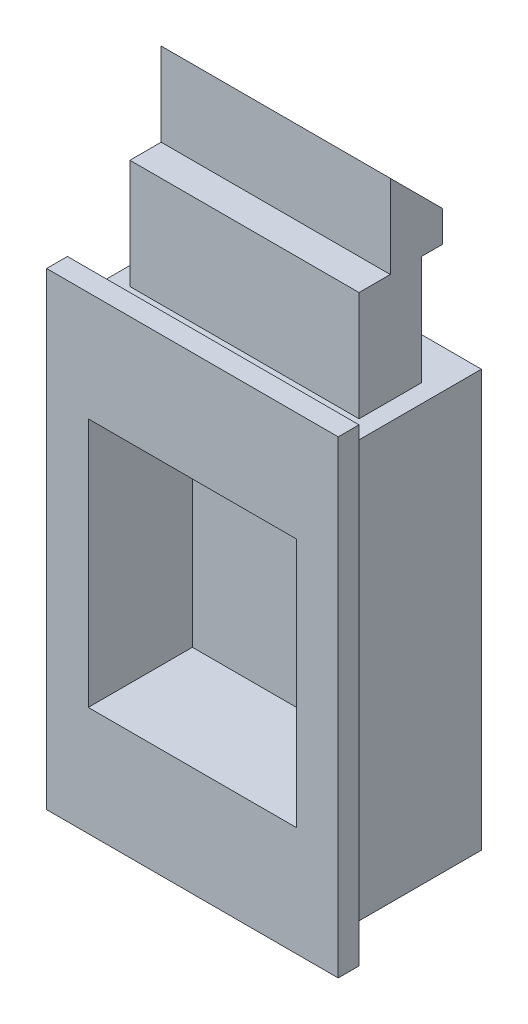
ISO-10303-21;
HEADER;
FILE_DESCRIPTION(('STEP AP214'),'2;1');
FILE_NAME('part.step','',(''),(''),'','','');
FILE_SCHEMA(('AUTOMOTIVE_DESIGN { 1 0 10303 214 1 1 1 1 }'));
ENDSEC;
DATA;
#1=APPLICATION_CONTEXT('core data for automotive mechanical design processes');
#2=APPLICATION_PROTOCOL_DEFINITION('international standard','automotive_design',2000,#1);
#3=PRODUCT_CONTEXT('',#1,'mechanical');
#4=PRODUCT('Part','Part','',(#3));
#5=PRODUCT_RELATED_PRODUCT_CATEGORY('part','',(#4));
#6=PRODUCT_DEFINITION_FORMATION('','',#4);
#7=PRODUCT_DEFINITION_CONTEXT('part definition',#1,'design');
#8=PRODUCT_DEFINITION('design','',#6,#7);
#9=PRODUCT_DEFINITION_SHAPE('','',#8);
#10=(LENGTH_UNIT() NAMED_UNIT(*) SI_UNIT(.MILLI.,.METRE.));
#11=(NAMED_UNIT(*) PLANE_ANGLE_UNIT() SI_UNIT($,.RADIAN.));
#12=(NAMED_UNIT(*) SI_UNIT($,.STERADIAN.) SOLID_ANGLE_UNIT());
#13=UNCERTAINTY_MEASURE_WITH_UNIT(LENGTH_MEASURE(1.E-05),#10,'distance_accuracy_value','');
#14=(GEOMETRIC_REPRESENTATION_CONTEXT(3) GLOBAL_UNCERTAINTY_ASSIGNED_CONTEXT((#13)) GLOBAL_UNIT_ASSIGNED_CONTEXT((#10,
#11,#12)) REPRESENTATION_CONTEXT('',''));
#15=CARTESIAN_POINT('',(0.,0.,0.));
#16=DIRECTION('',(0.,0.,1.));
#17=DIRECTION('',(1.,0.,0.));
#18=AXIS2_PLACEMENT_3D('',#15,#16,#17);
#19=CARTESIAN_POINT('',(12.75,20.,-13.));
#20=DIRECTION('',(0.,-1.,0.));
#21=DIRECTION('',(0.,0.,-1.));
#22=AXIS2_PLACEMENT_3D('',#19,#20,#21);
#23=PLANE('',#22);
#24=DIRECTION('',(1.,0.,0.));
#25=VECTOR('',#24,1.);
#26=CARTESIAN_POINT('',(12.75,20.,0.));
#27=LINE('',#26,#25);
#28=CARTESIAN_POINT('',(-12.75,20.,0.));
#29=VERTEX_POINT('',#28);
#30=CARTESIAN_POINT('',(12.75,20.,0.));
#31=VERTEX_POINT('',#30);
#32=EDGE_CURVE('E277',#29,#31,#27,.T.);
#33=ORIENTED_EDGE('',*,*,#32,.T.);
#34=DIRECTION('',(0.,0.,1.));
#35=VECTOR('',#34,1.);
#36=CARTESIAN_POINT('',(12.75,20.,-13.));
#37=LINE('',#36,#35);
#38=CARTESIAN_POINT('',(12.75,20.,-13.));
#39=VERTEX_POINT('',#38);
#40=EDGE_CURVE('E290',#39,#31,#37,.T.);
#41=ORIENTED_EDGE('',*,*,#40,.F.);
#42=DIRECTION('',(1.,0.,0.));
#43=VECTOR('',#42,1.);
#44=CARTESIAN_POINT('',(12.75,20.,-13.));
#45=LINE('',#44,#43);
#46=CARTESIAN_POINT('',(-12.75,20.,-13.));
#47=VERTEX_POINT('',#46);
#48=EDGE_CURVE('E267',#47,#39,#45,.T.);
#49=ORIENTED_EDGE('',*,*,#48,.F.);
#50=DIRECTION('',(0.,0.,1.));
#51=VECTOR('',#50,1.);
#52=CARTESIAN_POINT('',(-12.75,20.,-13.));
#53=LINE('',#52,#51);
#54=EDGE_CURVE('E293',#47,#29,#53,.T.);
#55=ORIENTED_EDGE('',*,*,#54,.T.);
#56=EDGE_LOOP('',(#33,#41,#49,#55));
#57=FACE_BOUND('',#56,.T.);
#58=DIRECTION('',(0.,0.,-1.));
#59=VECTOR('',#58,1.);
#60=CARTESIAN_POINT('',(11.,20.,-3.));
#61=LINE('',#60,#59);
#62=CARTESIAN_POINT('',(11.,20.,-3.));
#63=VERTEX_POINT('',#62);
#64=CARTESIAN_POINT('',(11.,20.,-9.));
#65=VERTEX_POINT('',#64);
#66=EDGE_CURVE('E210',#63,#65,#61,.T.);
#67=ORIENTED_EDGE('',*,*,#66,.F.);
#68=DIRECTION('',(-1.,0.,0.));
#69=VECTOR('',#68,1.);
#70=CARTESIAN_POINT('',(11.,20.,-3.));
#71=LINE('',#70,#69);
#72=CARTESIAN_POINT('',(-11.,20.,-3.));
#73=VERTEX_POINT('',#72);
#74=EDGE_CURVE('E260',#63,#73,#71,.T.);
#75=ORIENTED_EDGE('',*,*,#74,.T.);
#76=DIRECTION('',(0.,0.,-1.));
#77=VECTOR('',#76,1.);
#78=CARTESIAN_POINT('',(-11.,20.,-3.));
#79=LINE('',#78,#77);
#80=CARTESIAN_POINT('',(-11.,20.,-9.));
#81=VERTEX_POINT('',#80);
#82=EDGE_CURVE('E228',#73,#81,#79,.T.);
#83=ORIENTED_EDGE('',*,*,#82,.T.);
#84=DIRECTION('',(-1.,0.,0.));
#85=VECTOR('',#84,1.);
#86=CARTESIAN_POINT('',(11.,20.,-9.));
#87=LINE('',#86,#85);
#88=EDGE_CURVE('E258',#65,#81,#87,.T.);
#89=ORIENTED_EDGE('',*,*,#88,.F.);
#90=EDGE_LOOP('',(#67,#75,#83,#89));
#91=FACE_BOUND('',#90,.T.);
#92=ADVANCED_FACE('F32',(#57,#91),#23,.F.);
#93=CARTESIAN_POINT('',(-14.,22.5,0.));
#94=DIRECTION('',(0.,0.,1.));
#95=DIRECTION('',(1.,0.,0.));
#96=AXIS2_PLACEMENT_3D('',#93,#94,#95);
#97=PLANE('',#96);
#98=DIRECTION('',(0.,-1.,0.));
#99=VECTOR('',#98,1.);
#100=CARTESIAN_POINT('',(-14.,-22.5,0.));
#101=LINE('',#100,#99);
#102=CARTESIAN_POINT('',(-14.,22.5,0.));
#103=VERTEX_POINT('',#102);
#104=CARTESIAN_POINT('',(-14.,-22.5,0.));
#105=VERTEX_POINT('',#104);
#106=EDGE_CURVE('E296',#103,#105,#101,.T.);
#107=ORIENTED_EDGE('',*,*,#106,.F.);
#108=DIRECTION('',(-1.,0.,0.));
#109=VECTOR('',#108,1.);
#110=CARTESIAN_POINT('',(14.,22.5,0.));
#111=LINE('',#110,#109);
#112=CARTESIAN_POINT('',(14.,22.5,0.));
#113=VERTEX_POINT('',#112);
#114=EDGE_CURVE('E301',#113,#103,#111,.T.);
#115=ORIENTED_EDGE('',*,*,#114,.F.);
#116=DIRECTION('',(0.,1.,0.));
#117=VECTOR('',#116,1.);
#118=CARTESIAN_POINT('',(14.,-22.5,0.));
#119=LINE('',#118,#117);
#120=CARTESIAN_POINT('',(14.,-22.5,0.));
#121=VERTEX_POINT('',#120);
#122=EDGE_CURVE('E312',#121,#113,#119,.T.);
#123=ORIENTED_EDGE('',*,*,#122,.F.);
#124=DIRECTION('',(1.,0.,0.));
#125=VECTOR('',#124,1.);
#126=CARTESIAN_POINT('',(14.,-22.5,0.));
#127=LINE('',#126,#125);
#128=EDGE_CURVE('E310',#105,#121,#127,.T.);
#129=ORIENTED_EDGE('',*,*,#128,.F.);
#130=EDGE_LOOP('',(#107,#115,#123,#129));
#131=FACE_BOUND('',#130,.T.);
#132=DIRECTION('',(0.,1.,0.));
#133=VECTOR('',#132,1.);
#134=CARTESIAN_POINT('',(-12.75,20.,0.));
#135=LINE('',#134,#133);
#136=CARTESIAN_POINT('',(-12.75,-20.,0.));
#137=VERTEX_POINT('',#136);
#138=EDGE_CURVE('E263',#137,#29,#135,.T.);
#139=ORIENTED_EDGE('',*,*,#138,.F.);
#140=DIRECTION('',(-1.,0.,0.));
#141=VECTOR('',#140,1.);
#142=CARTESIAN_POINT('',(12.75,-20.,0.));
#143=LINE('',#142,#141);
#144=CARTESIAN_POINT('',(12.75,-20.,0.));
#145=VERTEX_POINT('',#144);
#146=EDGE_CURVE('E268',#145,#137,#143,.T.);
#147=ORIENTED_EDGE('',*,*,#146,.F.);
#148=DIRECTION('',(0.,-1.,0.));
#149=VECTOR('',#148,1.);
#150=CARTESIAN_POINT('',(12.75,20.,0.));
#151=LINE('',#150,#149);
#152=EDGE_CURVE('E280',#31,#145,#151,.T.);
#153=ORIENTED_EDGE('',*,*,#152,.F.);
#154=ORIENTED_EDGE('',*,*,#32,.F.);
#155=EDGE_LOOP('',(#139,#147,#153,#154));
#156=FACE_BOUND('',#155,.T.);
#157=ADVANCED_FACE('F330',(#131,#156),#97,.F.);
#158=CARTESIAN_POINT('',(-14.,-22.5,2.));
#159=DIRECTION('',(1.,0.,0.));
#160=DIRECTION('',(0.,0.,-1.));
#161=AXIS2_PLACEMENT_3D('',#158,#159,#160);
#162=PLANE('',#161);
#163=ORIENTED_EDGE('',*,*,#106,.T.);
#164=DIRECTION('',(0.,0.,-1.));
#165=VECTOR('',#164,1.);
#166=CARTESIAN_POINT('',(-14.,-22.5,2.));
#167=LINE('',#166,#165);
#168=CARTESIAN_POINT('',(-14.,-22.5,2.));
#169=VERTEX_POINT('',#168);
#170=EDGE_CURVE('E11',#169,#105,#167,.T.);
#171=ORIENTED_EDGE('',*,*,#170,.F.);
#172=DIRECTION('',(0.,-1.,0.));
#173=VECTOR('',#172,1.);
#174=CARTESIAN_POINT('',(-14.,-22.5,2.));
#175=LINE('',#174,#173);
#176=CARTESIAN_POINT('',(-14.,22.5,2.));
#177=VERTEX_POINT('',#176);
#178=EDGE_CURVE('E297',#177,#169,#175,.T.);
#179=ORIENTED_EDGE('',*,*,#178,.F.);
#180=DIRECTION('',(0.,0.,-1.));
#181=VECTOR('',#180,1.);
#182=CARTESIAN_POINT('',(-14.,22.5,2.));
#183=LINE('',#182,#181);
#184=EDGE_CURVE('E307',#177,#103,#183,.T.);
#185=ORIENTED_EDGE('',*,*,#184,.T.);
#186=EDGE_LOOP('',(#163,#171,#179,#185));
#187=FACE_BOUND('',#186,.T.);
#188=ADVANCED_FACE('F34',(#187),#162,.F.);
#189=CARTESIAN_POINT('',(14.,-22.5,2.));
#190=DIRECTION('',(0.,1.,0.));
#191=DIRECTION('',(-1.,0.,0.));
#192=AXIS2_PLACEMENT_3D('',#189,#190,#191);
#193=PLANE('',#192);
#194=ORIENTED_EDGE('',*,*,#128,.T.);
#195=DIRECTION('',(0.,0.,-1.));
#196=VECTOR('',#195,1.);
#197=CARTESIAN_POINT('',(14.,-22.5,2.));
#198=LINE('',#197,#196);
#199=CARTESIAN_POINT('',(14.,-22.5,2.));
#200=VERTEX_POINT('',#199);
#201=EDGE_CURVE('E40',#200,#121,#198,.T.);
#202=ORIENTED_EDGE('',*,*,#201,.F.);
#203=DIRECTION('',(1.,0.,0.));
#204=VECTOR('',#203,1.);
#205=CARTESIAN_POINT('',(14.,-22.5,2.));
#206=LINE('',#205,#204);
#207=EDGE_CURVE('E300',#169,#200,#206,.T.);
#208=ORIENTED_EDGE('',*,*,#207,.F.);
#209=ORIENTED_EDGE('',*,*,#170,.T.);
#210=EDGE_LOOP('',(#194,#202,#208,#209));
#211=FACE_BOUND('',#210,.T.);
#212=ADVANCED_FACE('F341',(#211),#193,.F.);
#213=CARTESIAN_POINT('',(14.,-22.5,2.));
#214=DIRECTION('',(-1.,0.,0.));
#215=DIRECTION('',(0.,0.,1.));
#216=AXIS2_PLACEMENT_3D('',#213,#214,#215);
#217=PLANE('',#216);
#218=ORIENTED_EDGE('',*,*,#122,.T.);
#219=DIRECTION('',(0.,0.,-1.));
#220=VECTOR('',#219,1.);
#221=CARTESIAN_POINT('',(14.,22.5,2.));
#222=LINE('',#221,#220);
#223=CARTESIAN_POINT('',(14.,22.5,2.));
#224=VERTEX_POINT('',#223);
#225=EDGE_CURVE('E317',#224,#113,#222,.T.);
#226=ORIENTED_EDGE('',*,*,#225,.F.);
#227=DIRECTION('',(0.,1.,0.));
#228=VECTOR('',#227,1.);
#229=CARTESIAN_POINT('',(14.,-22.5,2.));
#230=LINE('',#229,#228);
#231=EDGE_CURVE('E303',#200,#224,#230,.T.);
#232=ORIENTED_EDGE('',*,*,#231,.F.);
#233=ORIENTED_EDGE('',*,*,#201,.T.);
#234=EDGE_LOOP('',(#218,#226,#232,#233));
#235=FACE_BOUND('',#234,.T.);
#236=ADVANCED_FACE('F324',(#235),#217,.F.);
#237=CARTESIAN_POINT('',(14.,22.5,2.));
#238=DIRECTION('',(0.,-1.,0.));
#239=DIRECTION('',(1.,0.,0.));
#240=AXIS2_PLACEMENT_3D('',#237,#238,#239);
#241=PLANE('',#240);
#242=ORIENTED_EDGE('',*,*,#114,.T.);
#243=ORIENTED_EDGE('',*,*,#184,.F.);
#244=DIRECTION('',(-1.,0.,0.));
#245=VECTOR('',#244,1.);
#246=CARTESIAN_POINT('',(14.,22.5,2.));
#247=LINE('',#246,#245);
#248=EDGE_CURVE('E305',#224,#177,#247,.T.);
#249=ORIENTED_EDGE('',*,*,#248,.F.);
#250=ORIENTED_EDGE('',*,*,#225,.T.);
#251=EDGE_LOOP('',(#242,#243,#249,#250));
#252=FACE_BOUND('',#251,.T.);
#253=ADVANCED_FACE('F334',(#252),#241,.F.);
#254=CARTESIAN_POINT('',(-14.,22.5,2.));
#255=DIRECTION('',(0.,0.,1.));
#256=DIRECTION('',(1.,0.,0.));
#257=AXIS2_PLACEMENT_3D('',#254,#255,#256);
#258=PLANE('',#257);
#259=DIRECTION('',(0.,1.,0.));
#260=VECTOR('',#259,1.);
#261=CARTESIAN_POINT('',(10.,12.,2.));
#262=LINE('',#261,#260);
#263=CARTESIAN_POINT('',(10.,-12.,2.));
#264=VERTEX_POINT('',#263);
#265=CARTESIAN_POINT('',(10.,12.,2.));
#266=VERTEX_POINT('',#265);
#267=EDGE_CURVE('E47',#264,#266,#262,.T.);
#268=ORIENTED_EDGE('',*,*,#267,.F.);
#269=DIRECTION('',(1.,0.,0.));
#270=VECTOR('',#269,1.);
#271=CARTESIAN_POINT('',(-10.,-12.,2.));
#272=LINE('',#271,#270);
#273=CARTESIAN_POINT('',(-10.,-12.,2.));
#274=VERTEX_POINT('',#273);
#275=EDGE_CURVE('E189',#274,#264,#272,.T.);
#276=ORIENTED_EDGE('',*,*,#275,.F.);
#277=DIRECTION('',(0.,-1.,0.));
#278=VECTOR('',#277,1.);
#279=CARTESIAN_POINT('',(-10.,12.,2.));
#280=LINE('',#279,#278);
#281=CARTESIAN_POINT('',(-10.,12.,2.));
#282=VERTEX_POINT('',#281);
#283=EDGE_CURVE('E192',#282,#274,#280,.T.);
#284=ORIENTED_EDGE('',*,*,#283,.F.);
#285=DIRECTION('',(-1.,0.,0.));
#286=VECTOR('',#285,1.);
#287=CARTESIAN_POINT('',(-10.,12.,2.));
#288=LINE('',#287,#286);
#289=EDGE_CURVE('E198',#266,#282,#288,.T.);
#290=ORIENTED_EDGE('',*,*,#289,.F.);
#291=EDGE_LOOP('',(#268,#276,#284,#290));
#292=FACE_BOUND('',#291,.T.);
#293=ORIENTED_EDGE('',*,*,#178,.T.);
#294=ORIENTED_EDGE('',*,*,#207,.T.);
#295=ORIENTED_EDGE('',*,*,#231,.T.);
#296=ORIENTED_EDGE('',*,*,#248,.T.);
#297=EDGE_LOOP('',(#293,#294,#295,#296));
#298=FACE_BOUND('',#297,.T.);
#299=ADVANCED_FACE('F340',(#292,#298),#258,.T.);
#300=CARTESIAN_POINT('',(-12.75,20.,-13.));
#301=DIRECTION('',(1.,0.,0.));
#302=DIRECTION('',(0.,1.,0.));
#303=AXIS2_PLACEMENT_3D('',#300,#301,#302);
#304=PLANE('',#303);
#305=ORIENTED_EDGE('',*,*,#138,.T.);
#306=ORIENTED_EDGE('',*,*,#54,.F.);
#307=DIRECTION('',(0.,1.,0.));
#308=VECTOR('',#307,1.);
#309=CARTESIAN_POINT('',(-12.75,20.,-13.));
#310=LINE('',#309,#308);
#311=CARTESIAN_POINT('',(-12.75,-20.,-13.));
#312=VERTEX_POINT('',#311);
#313=EDGE_CURVE('E264',#312,#47,#310,.T.);
#314=ORIENTED_EDGE('',*,*,#313,.F.);
#315=DIRECTION('',(0.,0.,1.));
#316=VECTOR('',#315,1.);
#317=CARTESIAN_POINT('',(-12.75,-20.,-13.));
#318=LINE('',#317,#316);
#319=EDGE_CURVE('E274',#312,#137,#318,.T.);
#320=ORIENTED_EDGE('',*,*,#319,.T.);
#321=EDGE_LOOP('',(#305,#306,#314,#320));
#322=FACE_BOUND('',#321,.T.);
#323=ADVANCED_FACE('F360',(#322),#304,.F.);
#324=CARTESIAN_POINT('',(12.75,20.,-13.));
#325=DIRECTION('',(-1.,0.,0.));
#326=DIRECTION('',(0.,-1.,0.));
#327=AXIS2_PLACEMENT_3D('',#324,#325,#326);
#328=PLANE('',#327);
#329=ORIENTED_EDGE('',*,*,#152,.T.);
#330=DIRECTION('',(0.,0.,1.));
#331=VECTOR('',#330,1.);
#332=CARTESIAN_POINT('',(12.75,-20.,-13.));
#333=LINE('',#332,#331);
#334=CARTESIAN_POINT('',(12.75,-20.,-13.));
#335=VERTEX_POINT('',#334);
#336=EDGE_CURVE('E287',#335,#145,#333,.T.);
#337=ORIENTED_EDGE('',*,*,#336,.F.);
#338=DIRECTION('',(0.,-1.,0.));
#339=VECTOR('',#338,1.);
#340=CARTESIAN_POINT('',(12.75,20.,-13.));
#341=LINE('',#340,#339);
#342=EDGE_CURVE('E270',#39,#335,#341,.T.);
#343=ORIENTED_EDGE('',*,*,#342,.F.);
#344=ORIENTED_EDGE('',*,*,#40,.T.);
#345=EDGE_LOOP('',(#329,#337,#343,#344));
#346=FACE_BOUND('',#345,.T.);
#347=ADVANCED_FACE('F358',(#346),#328,.F.);
#348=CARTESIAN_POINT('',(12.75,-20.,-13.));
#349=DIRECTION('',(0.,1.,0.));
#350=DIRECTION('',(0.,0.,1.));
#351=AXIS2_PLACEMENT_3D('',#348,#349,#350);
#352=PLANE('',#351);
#353=ORIENTED_EDGE('',*,*,#146,.T.);
#354=ORIENTED_EDGE('',*,*,#319,.F.);
#355=DIRECTION('',(-1.,0.,0.));
#356=VECTOR('',#355,1.);
#357=CARTESIAN_POINT('',(12.75,-20.,-13.));
#358=LINE('',#357,#356);
#359=EDGE_CURVE('E272',#335,#312,#358,.T.);
#360=ORIENTED_EDGE('',*,*,#359,.F.);
#361=ORIENTED_EDGE('',*,*,#336,.T.);
#362=EDGE_LOOP('',(#353,#354,#360,#361));
#363=FACE_BOUND('',#362,.T.);
#364=ADVANCED_FACE('F389',(#363),#352,.F.);
#365=CARTESIAN_POINT('',(-12.75,-20.,-13.));
#366=DIRECTION('',(0.,0.,-1.));
#367=DIRECTION('',(-1.,0.,0.));
#368=AXIS2_PLACEMENT_3D('',#365,#366,#367);
#369=PLANE('',#368);
#370=ORIENTED_EDGE('',*,*,#313,.T.);
#371=ORIENTED_EDGE('',*,*,#48,.T.);
#372=ORIENTED_EDGE('',*,*,#342,.T.);
#373=ORIENTED_EDGE('',*,*,#359,.T.);
#374=EDGE_LOOP('',(#370,#371,#372,#373));
#375=FACE_BOUND('',#374,.T.);
#376=ADVANCED_FACE('F396',(#375),#369,.T.);
#377=CARTESIAN_POINT('',(11.,20.,-3.));
#378=DIRECTION('',(0.,0.,-1.));
#379=DIRECTION('',(0.,1.,0.));
#380=AXIS2_PLACEMENT_3D('',#377,#378,#379);
#381=PLANE('',#380);
#382=DIRECTION('',(0.,-1.,0.));
#383=VECTOR('',#382,1.);
#384=CARTESIAN_POINT('',(-11.,20.,-3.));
#385=LINE('',#384,#383);
#386=CARTESIAN_POINT('',(-11.,30.5,-3.));
#387=VERTEX_POINT('',#386);
#388=EDGE_CURVE('E204',#387,#73,#385,.T.);
#389=ORIENTED_EDGE('',*,*,#388,.T.);
#390=ORIENTED_EDGE('',*,*,#74,.F.);
#391=DIRECTION('',(0.,-1.,0.));
#392=VECTOR('',#391,1.);
#393=CARTESIAN_POINT('',(11.,20.,-3.));
#394=LINE('',#393,#392);
#395=CARTESIAN_POINT('',(11.,30.5,-3.));
#396=VERTEX_POINT('',#395);
#397=EDGE_CURVE('E208',#396,#63,#394,.T.);
#398=ORIENTED_EDGE('',*,*,#397,.F.);
#399=DIRECTION('',(-1.,0.,0.));
#400=VECTOR('',#399,1.);
#401=CARTESIAN_POINT('',(11.,30.5,-3.));
#402=LINE('',#401,#400);
#403=EDGE_CURVE('E225',#396,#387,#402,.T.);
#404=ORIENTED_EDGE('',*,*,#403,.T.);
#405=EDGE_LOOP('',(#389,#390,#398,#404));
#406=FACE_BOUND('',#405,.T.);
#407=ADVANCED_FACE('F403',(#406),#381,.F.);
#408=CARTESIAN_POINT('',(11.,20.,-9.));
#409=DIRECTION('',(0.,0.,1.));
#410=DIRECTION('',(1.,0.,0.));
#411=AXIS2_PLACEMENT_3D('',#408,#409,#410);
#412=PLANE('',#411);
#413=DIRECTION('',(0.,1.,0.));
#414=VECTOR('',#413,1.);
#415=CARTESIAN_POINT('',(-11.,20.,-9.));
#416=LINE('',#415,#414);
#417=CARTESIAN_POINT('',(-11.,30.5,-9.));
#418=VERTEX_POINT('',#417);
#419=EDGE_CURVE('E55',#81,#418,#416,.T.);
#420=ORIENTED_EDGE('',*,*,#419,.T.);
#421=DIRECTION('',(-1.,0.,0.));
#422=VECTOR('',#421,1.);
#423=CARTESIAN_POINT('',(11.,30.5,-9.));
#424=LINE('',#423,#422);
#425=CARTESIAN_POINT('',(11.,30.5,-9.));
#426=VERTEX_POINT('',#425);
#427=EDGE_CURVE('E255',#426,#418,#424,.T.);
#428=ORIENTED_EDGE('',*,*,#427,.F.);
#429=DIRECTION('',(0.,1.,0.));
#430=VECTOR('',#429,1.);
#431=CARTESIAN_POINT('',(11.,20.,-9.));
#432=LINE('',#431,#430);
#433=EDGE_CURVE('E213',#65,#426,#432,.T.);
#434=ORIENTED_EDGE('',*,*,#433,.F.);
#435=ORIENTED_EDGE('',*,*,#88,.T.);
#436=EDGE_LOOP('',(#420,#428,#434,#435));
#437=FACE_BOUND('',#436,.T.);
#438=ADVANCED_FACE('F411',(#437),#412,.F.);
#439=CARTESIAN_POINT('',(11.,30.5,-11.));
#440=DIRECTION('',(0.,1.,0.));
#441=DIRECTION('',(0.,0.,1.));
#442=AXIS2_PLACEMENT_3D('',#439,#440,#441);
#443=PLANE('',#442);
#444=DIRECTION('',(0.,0.,-1.));
#445=VECTOR('',#444,1.);
#446=CARTESIAN_POINT('',(-11.,30.5,-11.));
#447=LINE('',#446,#445);
#448=CARTESIAN_POINT('',(-11.,30.5,-11.));
#449=VERTEX_POINT('',#448);
#450=EDGE_CURVE('E232',#418,#449,#447,.T.);
#451=ORIENTED_EDGE('',*,*,#450,.T.);
#452=DIRECTION('',(-1.,0.,0.));
#453=VECTOR('',#452,1.);
#454=CARTESIAN_POINT('',(11.,30.5,-11.));
#455=LINE('',#454,#453);
#456=CARTESIAN_POINT('',(11.,30.5,-11.));
#457=VERTEX_POINT('',#456);
#458=EDGE_CURVE('E252',#457,#449,#455,.T.);
#459=ORIENTED_EDGE('',*,*,#458,.F.);
#460=DIRECTION('',(0.,0.,-1.));
#461=VECTOR('',#460,1.);
#462=CARTESIAN_POINT('',(11.,30.5,-11.));
#463=LINE('',#462,#461);
#464=EDGE_CURVE('E215',#426,#457,#463,.T.);
#465=ORIENTED_EDGE('',*,*,#464,.F.);
#466=ORIENTED_EDGE('',*,*,#427,.T.);
#467=EDGE_LOOP('',(#451,#459,#465,#466));
#468=FACE_BOUND('',#467,.T.);
#469=ADVANCED_FACE('F419',(#468),#443,.F.);
#470=CARTESIAN_POINT('',(11.,33.5,-11.));
#471=DIRECTION('',(0.,0.,1.));
#472=DIRECTION('',(1.,0.,0.));
#473=AXIS2_PLACEMENT_3D('',#470,#471,#472);
#474=PLANE('',#473);
#475=DIRECTION('',(0.,1.,0.));
#476=VECTOR('',#475,1.);
#477=CARTESIAN_POINT('',(-11.,33.5,-11.));
#478=LINE('',#477,#476);
#479=CARTESIAN_POINT('',(-11.,33.5,-11.));
#480=VERTEX_POINT('',#479);
#481=EDGE_CURVE('E234',#449,#480,#478,.T.);
#482=ORIENTED_EDGE('',*,*,#481,.T.);
#483=DIRECTION('',(-1.,0.,0.));
#484=VECTOR('',#483,1.);
#485=CARTESIAN_POINT('',(11.,33.5,-11.));
#486=LINE('',#485,#484);
#487=CARTESIAN_POINT('',(11.,33.5,-11.));
#488=VERTEX_POINT('',#487);
#489=EDGE_CURVE('E249',#488,#480,#486,.T.);
#490=ORIENTED_EDGE('',*,*,#489,.F.);
#491=DIRECTION('',(0.,1.,0.));
#492=VECTOR('',#491,1.);
#493=CARTESIAN_POINT('',(11.,33.5,-11.));
#494=LINE('',#493,#492);
#495=EDGE_CURVE('E217',#457,#488,#494,.T.);
#496=ORIENTED_EDGE('',*,*,#495,.F.);
#497=ORIENTED_EDGE('',*,*,#458,.T.);
#498=EDGE_LOOP('',(#482,#490,#496,#497));
#499=FACE_BOUND('',#498,.T.);
#500=ADVANCED_FACE('F427',(#499),#474,.F.);
#501=CARTESIAN_POINT('',(11.,38.5,-6.));
#502=DIRECTION('',(0.,-0.707106781186547,0.707106781186548));
#503=DIRECTION('',(0.,-0.707106781186548,-0.707106781186547));
#504=AXIS2_PLACEMENT_3D('',#501,#502,#503);
#505=PLANE('',#504);
#506=DIRECTION('',(0.,0.707106781186548,0.707106781186547));
#507=VECTOR('',#506,1.);
#508=CARTESIAN_POINT('',(-11.,38.5,-6.));
#509=LINE('',#508,#507);
#510=CARTESIAN_POINT('',(-11.,38.5,-6.));
#511=VERTEX_POINT('',#510);
#512=EDGE_CURVE('E236',#480,#511,#509,.T.);
#513=ORIENTED_EDGE('',*,*,#512,.T.);
#514=DIRECTION('',(-1.,0.,0.));
#515=VECTOR('',#514,1.);
#516=CARTESIAN_POINT('',(11.,38.5,-6.));
#517=LINE('',#516,#515);
#518=CARTESIAN_POINT('',(11.,38.5,-6.));
#519=VERTEX_POINT('',#518);
#520=EDGE_CURVE('E246',#519,#511,#517,.T.);
#521=ORIENTED_EDGE('',*,*,#520,.F.);
#522=DIRECTION('',(0.,0.707106781186548,0.707106781186547));
#523=VECTOR('',#522,1.);
#524=CARTESIAN_POINT('',(11.,38.5,-6.));
#525=LINE('',#524,#523);
#526=EDGE_CURVE('E219',#488,#519,#525,.T.);
#527=ORIENTED_EDGE('',*,*,#526,.F.);
#528=ORIENTED_EDGE('',*,*,#489,.T.);
#529=EDGE_LOOP('',(#513,#521,#527,#528));
#530=FACE_BOUND('',#529,.T.);
#531=ADVANCED_FACE('F435',(#530),#505,.F.);
#532=CARTESIAN_POINT('',(11.,30.5,-6.));
#533=DIRECTION('',(0.,0.,-1.));
#534=DIRECTION('',(-1.,0.,0.));
#535=AXIS2_PLACEMENT_3D('',#532,#533,#534);
#536=PLANE('',#535);
#537=DIRECTION('',(0.,-1.,0.));
#538=VECTOR('',#537,1.);
#539=CARTESIAN_POINT('',(-11.,30.5,-6.));
#540=LINE('',#539,#538);
#541=CARTESIAN_POINT('',(-11.,30.5,-6.));
#542=VERTEX_POINT('',#541);
#543=EDGE_CURVE('E238',#511,#542,#540,.T.);
#544=ORIENTED_EDGE('',*,*,#543,.T.);
#545=DIRECTION('',(-1.,0.,0.));
#546=VECTOR('',#545,1.);
#547=CARTESIAN_POINT('',(11.,30.5,-6.));
#548=LINE('',#547,#546);
#549=CARTESIAN_POINT('',(11.,30.5,-6.));
#550=VERTEX_POINT('',#549);
#551=EDGE_CURVE('E243',#550,#542,#548,.T.);
#552=ORIENTED_EDGE('',*,*,#551,.F.);
#553=DIRECTION('',(0.,-1.,0.));
#554=VECTOR('',#553,1.);
#555=CARTESIAN_POINT('',(11.,30.5,-6.));
#556=LINE('',#555,#554);
#557=EDGE_CURVE('E221',#519,#550,#556,.T.);
#558=ORIENTED_EDGE('',*,*,#557,.F.);
#559=ORIENTED_EDGE('',*,*,#520,.T.);
#560=EDGE_LOOP('',(#544,#552,#558,#559));
#561=FACE_BOUND('',#560,.T.);
#562=ADVANCED_FACE('F443',(#561),#536,.F.);
#563=CARTESIAN_POINT('',(11.,30.5,-3.));
#564=DIRECTION('',(0.,-1.,0.));
#565=DIRECTION('',(0.,0.,-1.));
#566=AXIS2_PLACEMENT_3D('',#563,#564,#565);
#567=PLANE('',#566);
#568=DIRECTION('',(0.,0.,1.));
#569=VECTOR('',#568,1.);
#570=CARTESIAN_POINT('',(-11.,30.5,-3.));
#571=LINE('',#570,#569);
#572=EDGE_CURVE('E211',#542,#387,#571,.T.);
#573=ORIENTED_EDGE('',*,*,#572,.T.);
#574=ORIENTED_EDGE('',*,*,#403,.F.);
#575=DIRECTION('',(0.,0.,1.));
#576=VECTOR('',#575,1.);
#577=CARTESIAN_POINT('',(11.,30.5,-3.));
#578=LINE('',#577,#576);
#579=EDGE_CURVE('E223',#550,#396,#578,.T.);
#580=ORIENTED_EDGE('',*,*,#579,.F.);
#581=ORIENTED_EDGE('',*,*,#551,.T.);
#582=EDGE_LOOP('',(#573,#574,#580,#581));
#583=FACE_BOUND('',#582,.T.);
#584=ADVANCED_FACE('F451',(#583),#567,.F.);
#585=CARTESIAN_POINT('',(11.,30.5,-3.));
#586=DIRECTION('',(-1.,0.,0.));
#587=DIRECTION('',(0.,0.,1.));
#588=AXIS2_PLACEMENT_3D('',#585,#586,#587);
#589=PLANE('',#588);
#590=ORIENTED_EDGE('',*,*,#397,.T.);
#591=ORIENTED_EDGE('',*,*,#66,.T.);
#592=ORIENTED_EDGE('',*,*,#433,.T.);
#593=ORIENTED_EDGE('',*,*,#464,.T.);
#594=ORIENTED_EDGE('',*,*,#495,.T.);
#595=ORIENTED_EDGE('',*,*,#526,.T.);
#596=ORIENTED_EDGE('',*,*,#557,.T.);
#597=ORIENTED_EDGE('',*,*,#579,.T.);
#598=EDGE_LOOP('',(#590,#591,#592,#593,#594,#595,#596,#597));
#599=FACE_BOUND('',#598,.T.);
#600=ADVANCED_FACE('F459',(#599),#589,.F.);
#601=CARTESIAN_POINT('',(-11.,30.5,-3.));
#602=DIRECTION('',(-1.,0.,0.));
#603=DIRECTION('',(0.,0.,1.));
#604=AXIS2_PLACEMENT_3D('',#601,#602,#603);
#605=PLANE('',#604);
#606=ORIENTED_EDGE('',*,*,#388,.F.);
#607=ORIENTED_EDGE('',*,*,#572,.F.);
#608=ORIENTED_EDGE('',*,*,#543,.F.);
#609=ORIENTED_EDGE('',*,*,#512,.F.);
#610=ORIENTED_EDGE('',*,*,#481,.F.);
#611=ORIENTED_EDGE('',*,*,#450,.F.);
#612=ORIENTED_EDGE('',*,*,#419,.F.);
#613=ORIENTED_EDGE('',*,*,#82,.F.);
#614=EDGE_LOOP('',(#606,#607,#608,#609,#610,#611,#612,#613));
#615=FACE_BOUND('',#614,.T.);
#616=ADVANCED_FACE('F467',(#615),#605,.T.);
#617=CARTESIAN_POINT('',(10.,12.,-8.));
#618=DIRECTION('',(1.,0.,0.));
#619=DIRECTION('',(0.,1.,0.));
#620=AXIS2_PLACEMENT_3D('',#617,#618,#619);
#621=PLANE('',#620);
#622=ORIENTED_EDGE('',*,*,#267,.T.);
#623=DIRECTION('',(0.,0.,1.));
#624=VECTOR('',#623,1.);
#625=CARTESIAN_POINT('',(10.,12.,-8.));
#626=LINE('',#625,#624);
#627=CARTESIAN_POINT('',(10.,12.,-8.));
#628=VERTEX_POINT('',#627);
#629=EDGE_CURVE('E167',#628,#266,#626,.T.);
#630=ORIENTED_EDGE('',*,*,#629,.F.);
#631=DIRECTION('',(0.,1.,0.));
#632=VECTOR('',#631,1.);
#633=CARTESIAN_POINT('',(10.,12.,-8.));
#634=LINE('',#633,#632);
#635=CARTESIAN_POINT('',(10.,-12.,-8.));
#636=VERTEX_POINT('',#635);
#637=EDGE_CURVE('E171',#636,#628,#634,.T.);
#638=ORIENTED_EDGE('',*,*,#637,.F.);
#639=DIRECTION('',(0.,0.,1.));
#640=VECTOR('',#639,1.);
#641=CARTESIAN_POINT('',(10.,-12.,-8.));
#642=LINE('',#641,#640);
#643=EDGE_CURVE('E202',#636,#264,#642,.T.);
#644=ORIENTED_EDGE('',*,*,#643,.T.);
#645=EDGE_LOOP('',(#622,#630,#638,#644));
#646=FACE_BOUND('',#645,.T.);
#647=ADVANCED_FACE('F169',(#646),#621,.F.);
#648=CARTESIAN_POINT('',(-10.,-12.,-8.));
#649=DIRECTION('',(0.,-1.,0.));
#650=DIRECTION('',(0.,0.,-1.));
#651=AXIS2_PLACEMENT_3D('',#648,#649,#650);
#652=PLANE('',#651);
#653=ORIENTED_EDGE('',*,*,#275,.T.);
#654=ORIENTED_EDGE('',*,*,#643,.F.);
#655=DIRECTION('',(1.,0.,0.));
#656=VECTOR('',#655,1.);
#657=CARTESIAN_POINT('',(-10.,-12.,-8.));
#658=LINE('',#657,#656);
#659=CARTESIAN_POINT('',(-10.,-12.,-8.));
#660=VERTEX_POINT('',#659);
#661=EDGE_CURVE('E177',#660,#636,#658,.T.);
#662=ORIENTED_EDGE('',*,*,#661,.F.);
#663=DIRECTION('',(0.,0.,1.));
#664=VECTOR('',#663,1.);
#665=CARTESIAN_POINT('',(-10.,-12.,-8.));
#666=LINE('',#665,#664);
#667=EDGE_CURVE('E205',#660,#274,#666,.T.);
#668=ORIENTED_EDGE('',*,*,#667,.T.);
#669=EDGE_LOOP('',(#653,#654,#662,#668));
#670=FACE_BOUND('',#669,.T.);
#671=ADVANCED_FACE('F479',(#670),#652,.F.);
#672=CARTESIAN_POINT('',(-10.,12.,-8.));
#673=DIRECTION('',(-1.,0.,0.));
#674=DIRECTION('',(0.,-1.,0.));
#675=AXIS2_PLACEMENT_3D('',#672,#673,#674);
#676=PLANE('',#675);
#677=ORIENTED_EDGE('',*,*,#283,.T.);
#678=ORIENTED_EDGE('',*,*,#667,.F.);
#679=DIRECTION('',(0.,-1.,0.));
#680=VECTOR('',#679,1.);
#681=CARTESIAN_POINT('',(-10.,12.,-8.));
#682=LINE('',#681,#680);
#683=CARTESIAN_POINT('',(-10.,12.,-8.));
#684=VERTEX_POINT('',#683);
#685=EDGE_CURVE('E185',#684,#660,#682,.T.);
#686=ORIENTED_EDGE('',*,*,#685,.F.);
#687=DIRECTION('',(0.,0.,1.));
#688=VECTOR('',#687,1.);
#689=CARTESIAN_POINT('',(-10.,12.,-8.));
#690=LINE('',#689,#688);
#691=EDGE_CURVE('E176',#684,#282,#690,.T.);
#692=ORIENTED_EDGE('',*,*,#691,.T.);
#693=EDGE_LOOP('',(#677,#678,#686,#692));
#694=FACE_BOUND('',#693,.T.);
#695=ADVANCED_FACE('F486',(#694),#676,.F.);
#696=CARTESIAN_POINT('',(-10.,12.,-8.));
#697=DIRECTION('',(0.,1.,0.));
#698=DIRECTION('',(0.,0.,1.));
#699=AXIS2_PLACEMENT_3D('',#696,#697,#698);
#700=PLANE('',#699);
#701=ORIENTED_EDGE('',*,*,#289,.T.);
#702=ORIENTED_EDGE('',*,*,#691,.F.);
#703=DIRECTION('',(-1.,0.,0.));
#704=VECTOR('',#703,1.);
#705=CARTESIAN_POINT('',(-10.,12.,-8.));
#706=LINE('',#705,#704);
#707=EDGE_CURVE('E180',#628,#684,#706,.T.);
#708=ORIENTED_EDGE('',*,*,#707,.F.);
#709=ORIENTED_EDGE('',*,*,#629,.T.);
#710=EDGE_LOOP('',(#701,#702,#708,#709));
#711=FACE_BOUND('',#710,.T.);
#712=ADVANCED_FACE('F181',(#711),#700,.F.);
#713=CARTESIAN_POINT('',(10.,-12.,-8.));
#714=DIRECTION('',(0.,0.,1.));
#715=DIRECTION('',(1.,0.,0.));
#716=AXIS2_PLACEMENT_3D('',#713,#714,#715);
#717=PLANE('',#716);
#718=ORIENTED_EDGE('',*,*,#637,.T.);
#719=ORIENTED_EDGE('',*,*,#707,.T.);
#720=ORIENTED_EDGE('',*,*,#685,.T.);
#721=ORIENTED_EDGE('',*,*,#661,.T.);
#722=EDGE_LOOP('',(#718,#719,#720,#721));
#723=FACE_BOUND('',#722,.T.);
#724=ADVANCED_FACE('F187',(#723),#717,.T.);
#725=CLOSED_SHELL('',(#92,#157,#188,#212,#236,#253,#299,#323,#347,#364,#376,#407,#438,#469,#500,
#531,#562,#584,#600,#616,#647,#671,#695,#712,#724));
#726=MANIFOLD_SOLID_BREP('B2',#725);
#727=ADVANCED_BREP_SHAPE_REPRESENTATION('',(#18,#726),#14);
#728=SHAPE_DEFINITION_REPRESENTATION(#9,#727);
ENDSEC;
END-ISO-10303-21;
